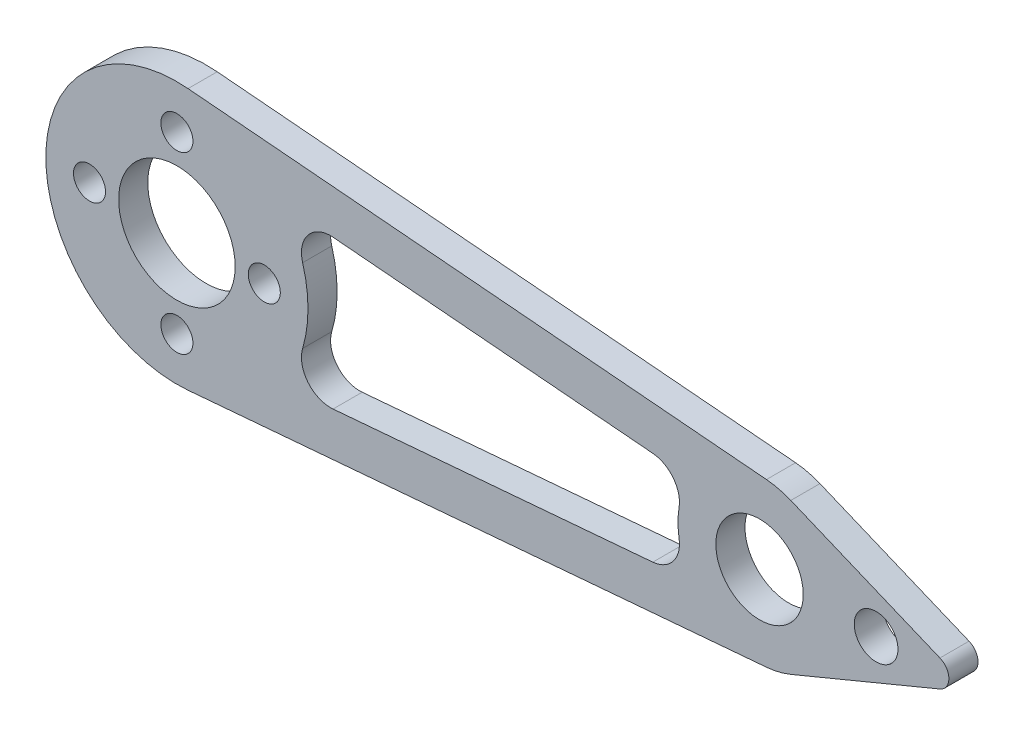
ISO-10303-21;
HEADER;
FILE_DESCRIPTION(('STEP AP214'),'2;1');
FILE_NAME('part.step','',(''),(''),'','','');
FILE_SCHEMA(('AUTOMOTIVE_DESIGN { 1 0 10303 214 1 1 1 1 }'));
ENDSEC;
DATA;
#1=APPLICATION_CONTEXT('core data for automotive mechanical design processes');
#2=APPLICATION_PROTOCOL_DEFINITION('international standard','automotive_design',2000,#1);
#3=PRODUCT_CONTEXT('',#1,'mechanical');
#4=PRODUCT('Part','Part','',(#3));
#5=PRODUCT_RELATED_PRODUCT_CATEGORY('part','',(#4));
#6=PRODUCT_DEFINITION_FORMATION('','',#4);
#7=PRODUCT_DEFINITION_CONTEXT('part definition',#1,'design');
#8=PRODUCT_DEFINITION('design','',#6,#7);
#9=PRODUCT_DEFINITION_SHAPE('','',#8);
#10=(LENGTH_UNIT() NAMED_UNIT(*) SI_UNIT(.MILLI.,.METRE.));
#11=(NAMED_UNIT(*) PLANE_ANGLE_UNIT() SI_UNIT($,.RADIAN.));
#12=(NAMED_UNIT(*) SI_UNIT($,.STERADIAN.) SOLID_ANGLE_UNIT());
#13=UNCERTAINTY_MEASURE_WITH_UNIT(LENGTH_MEASURE(1.E-05),#10,'distance_accuracy_value','');
#14=(GEOMETRIC_REPRESENTATION_CONTEXT(3) GLOBAL_UNCERTAINTY_ASSIGNED_CONTEXT((#13)) GLOBAL_UNIT_ASSIGNED_CONTEXT((#10,
#11,#12)) REPRESENTATION_CONTEXT('',''));
#15=CARTESIAN_POINT('',(0.,0.,0.));
#16=DIRECTION('',(0.,0.,1.));
#17=DIRECTION('',(1.,0.,0.));
#18=AXIS2_PLACEMENT_3D('',#15,#16,#17);
#19=CARTESIAN_POINT('',(40.,0.,0.));
#20=DIRECTION('',(0.,0.,1.));
#21=DIRECTION('',(1.,0.,0.));
#22=AXIS2_PLACEMENT_3D('',#19,#20,#21);
#23=CYLINDRICAL_SURFACE('',#22,5.6);
#24=CARTESIAN_POINT('',(40.,0.,2.));
#25=DIRECTION('',(0.,0.,1.));
#26=DIRECTION('',(1.,0.,0.));
#27=AXIS2_PLACEMENT_3D('',#24,#25,#26);
#28=CIRCLE('',#27,5.6);
#29=CARTESIAN_POINT('',(42.1466666666667,5.1722163742657,2.));
#30=VERTEX_POINT('',#29);
#31=CARTESIAN_POINT('',(40.476,5.57973332696107,2.));
#32=VERTEX_POINT('',#31);
#33=EDGE_CURVE('E188',#30,#32,#28,.T.);
#34=ORIENTED_EDGE('',*,*,#33,.F.);
#35=DIRECTION('',(0.,0.,1.));
#36=VECTOR('',#35,1.);
#37=CARTESIAN_POINT('',(42.1466666666667,5.1722163742657,0.));
#38=LINE('',#37,#36);
#39=CARTESIAN_POINT('',(42.1466666666667,5.1722163742657,0.));
#40=VERTEX_POINT('',#39);
#41=EDGE_CURVE('E306',#40,#30,#38,.T.);
#42=ORIENTED_EDGE('',*,*,#41,.F.);
#43=CARTESIAN_POINT('',(40.,0.,0.));
#44=DIRECTION('',(0.,0.,1.));
#45=DIRECTION('',(1.,0.,0.));
#46=AXIS2_PLACEMENT_3D('',#43,#44,#45);
#47=CIRCLE('',#46,5.6);
#48=CARTESIAN_POINT('',(40.476,5.57973332696107,0.));
#49=VERTEX_POINT('',#48);
#50=EDGE_CURVE('E177',#40,#49,#47,.T.);
#51=ORIENTED_EDGE('',*,*,#50,.T.);
#52=DIRECTION('',(0.,0.,1.));
#53=VECTOR('',#52,1.);
#54=CARTESIAN_POINT('',(40.476,5.57973332696107,0.));
#55=LINE('',#54,#53);
#56=EDGE_CURVE('E198',#49,#32,#55,.T.);
#57=ORIENTED_EDGE('',*,*,#56,.T.);
#58=EDGE_LOOP('',(#34,#42,#51,#57));
#59=FACE_BOUND('',#58,.T.);
#60=ADVANCED_FACE('F33',(#59),#23,.T.);
#61=CARTESIAN_POINT('',(0.,0.,2.));
#62=DIRECTION('',(0.,0.,1.));
#63=DIRECTION('',(1.,0.,0.));
#64=AXIS2_PLACEMENT_3D('',#61,#62,#63);
#65=PLANE('',#64);
#66=CARTESIAN_POINT('',(0.,0.,2.));
#67=DIRECTION('',(0.,0.,-1.));
#68=DIRECTION('',(1.,0.,0.));
#69=AXIS2_PLACEMENT_3D('',#66,#67,#68);
#70=CIRCLE('',#69,9.);
#71=CARTESIAN_POINT('',(8.63170899670432,2.54825426443551,2.));
#72=VERTEX_POINT('',#71);
#73=CARTESIAN_POINT('',(8.63170899670432,-2.54825426443551,2.));
#74=VERTEX_POINT('',#73);
#75=EDGE_CURVE('E276',#72,#74,#70,.T.);
#76=ORIENTED_EDGE('',*,*,#75,.F.);
#77=CARTESIAN_POINT('',(10.5498665515275,3.11453298986563,2.));
#78=DIRECTION('',(0.,0.,1.));
#79=DIRECTION('',(1.,0.,0.));
#80=AXIS2_PLACEMENT_3D('',#77,#78,#79);
#81=CIRCLE('',#80,2.);
#82=CARTESIAN_POINT('',(10.7198665515275,5.10729489235172,2.));
#83=VERTEX_POINT('',#82);
#84=EDGE_CURVE('E41',#72,#83,#81,.F.);
#85=ORIENTED_EDGE('',*,*,#84,.T.);
#86=DIRECTION('',(-0.996380951243047,0.0849999999999999,0.));
#87=VECTOR('',#86,1.);
#88=CARTESIAN_POINT('',(7.19392661539607,5.40808837319584,2.));
#89=LINE('',#88,#87);
#90=CARTESIAN_POINT('',(32.6721401523144,3.23457416867771,2.));
#91=VERTEX_POINT('',#90);
#92=EDGE_CURVE('E275',#91,#83,#89,.T.);
#93=ORIENTED_EDGE('',*,*,#92,.F.);
#94=CARTESIAN_POINT('',(32.5021401523144,1.24181226619161,2.));
#95=DIRECTION('',(0.,0.,1.));
#96=DIRECTION('',(1.,0.,0.));
#97=AXIS2_PLACEMENT_3D('',#94,#95,#96);
#98=CIRCLE('',#97,2.);
#99=CARTESIAN_POINT('',(34.4752611648632,0.915019564562241,2.));
#100=VERTEX_POINT('',#99);
#101=EDGE_CURVE('E262',#91,#100,#98,.F.);
#102=ORIENTED_EDGE('',*,*,#101,.T.);
#103=CARTESIAN_POINT('',(40.,0.,2.));
#104=DIRECTION('',(0.,0.,-1.));
#105=DIRECTION('',(1.,0.,0.));
#106=AXIS2_PLACEMENT_3D('',#103,#104,#105);
#107=CIRCLE('',#106,5.60000000000001);
#108=CARTESIAN_POINT('',(34.4752611648632,-0.915019564562241,2.));
#109=VERTEX_POINT('',#108);
#110=EDGE_CURVE('E286',#109,#100,#107,.T.);
#111=ORIENTED_EDGE('',*,*,#110,.F.);
#112=CARTESIAN_POINT('',(32.5021401523144,-1.24181226619161,2.));
#113=DIRECTION('',(0.,0.,1.));
#114=DIRECTION('',(1.,0.,0.));
#115=AXIS2_PLACEMENT_3D('',#112,#113,#114);
#116=CIRCLE('',#115,2.);
#117=CARTESIAN_POINT('',(32.6721401523144,-3.23457416867771,2.));
#118=VERTEX_POINT('',#117);
#119=EDGE_CURVE('E258',#109,#118,#116,.F.);
#120=ORIENTED_EDGE('',*,*,#119,.T.);
#121=DIRECTION('',(0.996380951243047,0.0849999999999999,0.));
#122=VECTOR('',#121,1.);
#123=CARTESIAN_POINT('',(7.19392661539607,-5.40808837319584,2.));
#124=LINE('',#123,#122);
#125=CARTESIAN_POINT('',(10.7198665515275,-5.10729489235172,2.));
#126=VERTEX_POINT('',#125);
#127=EDGE_CURVE('E305',#126,#118,#124,.T.);
#128=ORIENTED_EDGE('',*,*,#127,.F.);
#129=CARTESIAN_POINT('',(10.5498665515275,-3.11453298986563,2.));
#130=DIRECTION('',(0.,0.,1.));
#131=DIRECTION('',(1.,0.,0.));
#132=AXIS2_PLACEMENT_3D('',#129,#130,#131);
#133=CIRCLE('',#132,2.);
#134=EDGE_CURVE('E266',#126,#74,#133,.F.);
#135=ORIENTED_EDGE('',*,*,#134,.T.);
#136=EDGE_LOOP('',(#76,#85,#93,#102,#111,#120,#128,#135));
#137=FACE_BOUND('',#136,.T.);
#138=CARTESIAN_POINT('',(3.39590937005871E-13,-6.,2.));
#139=DIRECTION('',(0.,0.,1.));
#140=DIRECTION('',(1.,0.,0.));
#141=AXIS2_PLACEMENT_3D('',#138,#139,#140);
#142=CIRCLE('',#141,1.10000000000037);
#143=CARTESIAN_POINT('',(1.1000000000007,-6.,2.));
#144=VERTEX_POINT('',#143);
#145=EDGE_CURVE('E210',#144,#144,#142,.T.);
#146=ORIENTED_EDGE('',*,*,#145,.F.);
#147=EDGE_LOOP('',(#146));
#148=FACE_BOUND('',#147,.T.);
#149=CARTESIAN_POINT('',(0.,0.,2.));
#150=DIRECTION('',(0.,0.,1.));
#151=DIRECTION('',(1.,0.,0.));
#152=AXIS2_PLACEMENT_3D('',#149,#150,#151);
#153=CIRCLE('',#152,4.);
#154=CARTESIAN_POINT('',(4.,0.,2.));
#155=VERTEX_POINT('',#154);
#156=EDGE_CURVE('E222',#155,#155,#153,.T.);
#157=ORIENTED_EDGE('',*,*,#156,.F.);
#158=EDGE_LOOP('',(#157));
#159=FACE_BOUND('',#158,.T.);
#160=CARTESIAN_POINT('',(0.,0.,2.));
#161=DIRECTION('',(0.,0.,1.));
#162=DIRECTION('',(1.,0.,0.));
#163=AXIS2_PLACEMENT_3D('',#160,#161,#162);
#164=CIRCLE('',#163,9.);
#165=CARTESIAN_POINT('',(0.765000000000001,8.96742856118743,2.));
#166=VERTEX_POINT('',#165);
#167=CARTESIAN_POINT('',(0.765000000000001,-8.96742856118743,2.));
#168=VERTEX_POINT('',#167);
#169=EDGE_CURVE('E234',#166,#168,#164,.T.);
#170=ORIENTED_EDGE('',*,*,#169,.T.);
#171=DIRECTION('',(0.996380951243047,0.085,0.));
#172=VECTOR('',#171,1.);
#173=CARTESIAN_POINT('',(0.765000000000001,-8.96742856118743,2.));
#174=LINE('',#173,#172);
#175=CARTESIAN_POINT('',(40.476,-5.57973332696107,2.));
#176=VERTEX_POINT('',#175);
#177=EDGE_CURVE('E185',#168,#176,#174,.T.);
#178=ORIENTED_EDGE('',*,*,#177,.T.);
#179=CARTESIAN_POINT('',(42.1466666666667,-5.1722163742657,2.));
#180=VERTEX_POINT('',#179);
#181=EDGE_CURVE('E190',#176,#180,#28,.T.);
#182=ORIENTED_EDGE('',*,*,#181,.T.);
#183=DIRECTION('',(0.92361006683316,0.383333333333334,0.));
#184=VECTOR('',#183,1.);
#185=CARTESIAN_POINT('',(42.1466666666667,-5.1722163742657,2.));
#186=LINE('',#185,#184);
#187=CARTESIAN_POINT('',(52.3833333333333,-0.923610066833158,2.));
#188=VERTEX_POINT('',#187);
#189=EDGE_CURVE('E153',#180,#188,#186,.T.);
#190=ORIENTED_EDGE('',*,*,#189,.T.);
#191=CARTESIAN_POINT('',(52.,0.,2.));
#192=DIRECTION('',(0.,0.,1.));
#193=DIRECTION('',(1.,0.,0.));
#194=AXIS2_PLACEMENT_3D('',#191,#192,#193);
#195=CIRCLE('',#194,0.999999999999997);
#196=CARTESIAN_POINT('',(52.3833333333333,0.923610066833157,2.));
#197=VERTEX_POINT('',#196);
#198=EDGE_CURVE('E332',#188,#197,#195,.T.);
#199=ORIENTED_EDGE('',*,*,#198,.T.);
#200=DIRECTION('',(-0.92361006683316,0.383333333333334,0.));
#201=VECTOR('',#200,1.);
#202=CARTESIAN_POINT('',(42.1466666666667,5.1722163742657,2.));
#203=LINE('',#202,#201);
#204=EDGE_CURVE('E48',#197,#30,#203,.T.);
#205=ORIENTED_EDGE('',*,*,#204,.T.);
#206=ORIENTED_EDGE('',*,*,#33,.T.);
#207=DIRECTION('',(-0.996380951243047,0.085,0.));
#208=VECTOR('',#207,1.);
#209=CARTESIAN_POINT('',(0.765000000000001,8.96742856118743,2.));
#210=LINE('',#209,#208);
#211=EDGE_CURVE('E192',#32,#166,#210,.T.);
#212=ORIENTED_EDGE('',*,*,#211,.T.);
#213=EDGE_LOOP('',(#170,#178,#182,#190,#199,#205,#206,#212));
#214=FACE_BOUND('',#213,.T.);
#215=CARTESIAN_POINT('',(0.,6.,2.));
#216=DIRECTION('',(0.,0.,1.));
#217=DIRECTION('',(1.,0.,0.));
#218=AXIS2_PLACEMENT_3D('',#215,#216,#217);
#219=CIRCLE('',#218,1.1);
#220=CARTESIAN_POINT('',(1.1,6.,2.));
#221=VERTEX_POINT('',#220);
#222=EDGE_CURVE('E228',#221,#221,#219,.T.);
#223=ORIENTED_EDGE('',*,*,#222,.F.);
#224=EDGE_LOOP('',(#223));
#225=FACE_BOUND('',#224,.T.);
#226=CARTESIAN_POINT('',(6.00000000000017,1.69795468502936E-13,2.));
#227=DIRECTION('',(0.,0.,1.));
#228=DIRECTION('',(1.,0.,0.));
#229=AXIS2_PLACEMENT_3D('',#226,#227,#228);
#230=CIRCLE('',#229,1.10000000000013);
#231=CARTESIAN_POINT('',(7.1000000000003,1.69795468502936E-13,2.));
#232=VERTEX_POINT('',#231);
#233=EDGE_CURVE('E216',#232,#232,#230,.T.);
#234=ORIENTED_EDGE('',*,*,#233,.F.);
#235=EDGE_LOOP('',(#234));
#236=FACE_BOUND('',#235,.T.);
#237=CARTESIAN_POINT('',(-5.99999999999983,-1.70530256582424E-13,2.));
#238=DIRECTION('',(0.,0.,1.));
#239=DIRECTION('',(1.,0.,0.));
#240=AXIS2_PLACEMENT_3D('',#237,#238,#239);
#241=CIRCLE('',#240,1.10000000000027);
#242=CARTESIAN_POINT('',(-4.89999999999956,-1.70530256582424E-13,2.));
#243=VERTEX_POINT('',#242);
#244=EDGE_CURVE('E204',#243,#243,#241,.T.);
#245=ORIENTED_EDGE('',*,*,#244,.F.);
#246=EDGE_LOOP('',(#245));
#247=FACE_BOUND('',#246,.T.);
#248=CARTESIAN_POINT('',(40.,0.,2.));
#249=DIRECTION('',(0.,0.,1.));
#250=DIRECTION('',(1.,0.,0.));
#251=AXIS2_PLACEMENT_3D('',#248,#249,#250);
#252=CIRCLE('',#251,3.);
#253=CARTESIAN_POINT('',(43.,0.,2.));
#254=VERTEX_POINT('',#253);
#255=EDGE_CURVE('E303',#254,#254,#252,.T.);
#256=ORIENTED_EDGE('',*,*,#255,.F.);
#257=EDGE_LOOP('',(#256));
#258=FACE_BOUND('',#257,.T.);
#259=CARTESIAN_POINT('',(48.,0.,2.));
#260=DIRECTION('',(0.,0.,1.));
#261=DIRECTION('',(1.,0.,0.));
#262=AXIS2_PLACEMENT_3D('',#259,#260,#261);
#263=CIRCLE('',#262,1.5);
#264=CARTESIAN_POINT('',(49.5,0.,2.));
#265=VERTEX_POINT('',#264);
#266=EDGE_CURVE('E322',#265,#265,#263,.T.);
#267=ORIENTED_EDGE('',*,*,#266,.F.);
#268=EDGE_LOOP('',(#267));
#269=FACE_BOUND('',#268,.T.);
#270=ADVANCED_FACE('F273',(#137,#148,#159,#214,#225,#236,#247,#258,#269),#65,.T.);
#271=CARTESIAN_POINT('',(0.,0.,0.));
#272=DIRECTION('',(0.,0.,1.));
#273=DIRECTION('',(1.,0.,0.));
#274=AXIS2_PLACEMENT_3D('',#271,#272,#273);
#275=PLANE('',#274);
#276=CARTESIAN_POINT('',(40.,0.,0.));
#277=DIRECTION('',(0.,0.,-1.));
#278=DIRECTION('',(1.,0.,0.));
#279=AXIS2_PLACEMENT_3D('',#276,#277,#278);
#280=CIRCLE('',#279,5.60000000000001);
#281=CARTESIAN_POINT('',(34.4752611648632,-0.915019564562241,0.));
#282=VERTEX_POINT('',#281);
#283=CARTESIAN_POINT('',(34.4752611648632,0.915019564562241,0.));
#284=VERTEX_POINT('',#283);
#285=EDGE_CURVE('E297',#282,#284,#280,.T.);
#286=ORIENTED_EDGE('',*,*,#285,.T.);
#287=CARTESIAN_POINT('',(32.5021401523144,1.24181226619161,0.));
#288=DIRECTION('',(0.,0.,1.));
#289=DIRECTION('',(1.,0.,0.));
#290=AXIS2_PLACEMENT_3D('',#287,#288,#289);
#291=CIRCLE('',#290,2.);
#292=CARTESIAN_POINT('',(32.6721401523144,3.23457416867771,0.));
#293=VERTEX_POINT('',#292);
#294=EDGE_CURVE('E264',#284,#293,#291,.T.);
#295=ORIENTED_EDGE('',*,*,#294,.T.);
#296=DIRECTION('',(-0.996380951243047,0.0849999999999999,0.));
#297=VECTOR('',#296,1.);
#298=CARTESIAN_POINT('',(7.19392661539607,5.40808837319584,0.));
#299=LINE('',#298,#297);
#300=CARTESIAN_POINT('',(10.7198665515275,5.10729489235172,0.));
#301=VERTEX_POINT('',#300);
#302=EDGE_CURVE('E292',#293,#301,#299,.T.);
#303=ORIENTED_EDGE('',*,*,#302,.T.);
#304=CARTESIAN_POINT('',(10.5498665515275,3.11453298986563,0.));
#305=DIRECTION('',(0.,0.,1.));
#306=DIRECTION('',(1.,0.,0.));
#307=AXIS2_PLACEMENT_3D('',#304,#305,#306);
#308=CIRCLE('',#307,2.);
#309=CARTESIAN_POINT('',(8.63170899670432,2.54825426443551,0.));
#310=VERTEX_POINT('',#309);
#311=EDGE_CURVE('E11',#301,#310,#308,.T.);
#312=ORIENTED_EDGE('',*,*,#311,.T.);
#313=CARTESIAN_POINT('',(0.,0.,0.));
#314=DIRECTION('',(0.,0.,-1.));
#315=DIRECTION('',(1.,0.,0.));
#316=AXIS2_PLACEMENT_3D('',#313,#314,#315);
#317=CIRCLE('',#316,9.);
#318=CARTESIAN_POINT('',(8.63170899670432,-2.54825426443551,0.));
#319=VERTEX_POINT('',#318);
#320=EDGE_CURVE('E285',#310,#319,#317,.T.);
#321=ORIENTED_EDGE('',*,*,#320,.T.);
#322=CARTESIAN_POINT('',(10.5498665515275,-3.11453298986563,0.));
#323=DIRECTION('',(0.,0.,1.));
#324=DIRECTION('',(1.,0.,0.));
#325=AXIS2_PLACEMENT_3D('',#322,#323,#324);
#326=CIRCLE('',#325,2.);
#327=CARTESIAN_POINT('',(10.7198665515275,-5.10729489235172,0.));
#328=VERTEX_POINT('',#327);
#329=EDGE_CURVE('E268',#319,#328,#326,.T.);
#330=ORIENTED_EDGE('',*,*,#329,.T.);
#331=DIRECTION('',(0.996380951243047,0.0849999999999999,0.));
#332=VECTOR('',#331,1.);
#333=CARTESIAN_POINT('',(7.19392661539607,-5.40808837319584,0.));
#334=LINE('',#333,#332);
#335=CARTESIAN_POINT('',(32.6721401523144,-3.23457416867771,0.));
#336=VERTEX_POINT('',#335);
#337=EDGE_CURVE('E294',#328,#336,#334,.T.);
#338=ORIENTED_EDGE('',*,*,#337,.T.);
#339=CARTESIAN_POINT('',(32.5021401523144,-1.24181226619161,0.));
#340=DIRECTION('',(0.,0.,1.));
#341=DIRECTION('',(1.,0.,0.));
#342=AXIS2_PLACEMENT_3D('',#339,#340,#341);
#343=CIRCLE('',#342,2.);
#344=EDGE_CURVE('E260',#336,#282,#343,.T.);
#345=ORIENTED_EDGE('',*,*,#344,.T.);
#346=EDGE_LOOP('',(#286,#295,#303,#312,#321,#330,#338,#345));
#347=FACE_BOUND('',#346,.T.);
#348=CARTESIAN_POINT('',(0.,0.,0.));
#349=DIRECTION('',(0.,0.,1.));
#350=DIRECTION('',(1.,0.,0.));
#351=AXIS2_PLACEMENT_3D('',#348,#349,#350);
#352=CIRCLE('',#351,9.);
#353=CARTESIAN_POINT('',(0.765000000000001,8.96742856118743,0.));
#354=VERTEX_POINT('',#353);
#355=CARTESIAN_POINT('',(0.765000000000001,-8.96742856118743,0.));
#356=VERTEX_POINT('',#355);
#357=EDGE_CURVE('E231',#354,#356,#352,.T.);
#358=ORIENTED_EDGE('',*,*,#357,.F.);
#359=DIRECTION('',(-0.996380951243047,0.085,0.));
#360=VECTOR('',#359,1.);
#361=CARTESIAN_POINT('',(0.765000000000001,8.96742856118743,0.));
#362=LINE('',#361,#360);
#363=EDGE_CURVE('E176',#49,#354,#362,.T.);
#364=ORIENTED_EDGE('',*,*,#363,.F.);
#365=ORIENTED_EDGE('',*,*,#50,.F.);
#366=DIRECTION('',(-0.92361006683316,0.383333333333334,0.));
#367=VECTOR('',#366,1.);
#368=CARTESIAN_POINT('',(42.1466666666667,5.1722163742657,0.));
#369=LINE('',#368,#367);
#370=CARTESIAN_POINT('',(52.3833333333333,0.923610066833157,0.));
#371=VERTEX_POINT('',#370);
#372=EDGE_CURVE('E159',#371,#40,#369,.T.);
#373=ORIENTED_EDGE('',*,*,#372,.F.);
#374=CARTESIAN_POINT('',(52.,0.,0.));
#375=DIRECTION('',(0.,0.,1.));
#376=DIRECTION('',(1.,0.,0.));
#377=AXIS2_PLACEMENT_3D('',#374,#375,#376);
#378=CIRCLE('',#377,0.999999999999997);
#379=CARTESIAN_POINT('',(52.3833333333333,-0.923610066833158,0.));
#380=VERTEX_POINT('',#379);
#381=EDGE_CURVE('E172',#380,#371,#378,.T.);
#382=ORIENTED_EDGE('',*,*,#381,.F.);
#383=DIRECTION('',(0.92361006683316,0.383333333333334,0.));
#384=VECTOR('',#383,1.);
#385=CARTESIAN_POINT('',(42.1466666666667,-5.1722163742657,0.));
#386=LINE('',#385,#384);
#387=CARTESIAN_POINT('',(42.1466666666667,-5.1722163742657,0.));
#388=VERTEX_POINT('',#387);
#389=EDGE_CURVE('E151',#388,#380,#386,.T.);
#390=ORIENTED_EDGE('',*,*,#389,.F.);
#391=CARTESIAN_POINT('',(40.476,-5.57973332696107,0.));
#392=VERTEX_POINT('',#391);
#393=EDGE_CURVE('E168',#392,#388,#47,.T.);
#394=ORIENTED_EDGE('',*,*,#393,.F.);
#395=DIRECTION('',(0.996380951243047,0.085,0.));
#396=VECTOR('',#395,1.);
#397=CARTESIAN_POINT('',(0.765000000000001,-8.96742856118743,0.));
#398=LINE('',#397,#396);
#399=EDGE_CURVE('E181',#356,#392,#398,.T.);
#400=ORIENTED_EDGE('',*,*,#399,.F.);
#401=EDGE_LOOP('',(#358,#364,#365,#373,#382,#390,#394,#400));
#402=FACE_BOUND('',#401,.T.);
#403=CARTESIAN_POINT('',(0.,6.,0.));
#404=DIRECTION('',(0.,0.,1.));
#405=DIRECTION('',(1.,0.,0.));
#406=AXIS2_PLACEMENT_3D('',#403,#404,#405);
#407=CIRCLE('',#406,1.1);
#408=CARTESIAN_POINT('',(1.1,6.,0.));
#409=VERTEX_POINT('',#408);
#410=EDGE_CURVE('E225',#409,#409,#407,.T.);
#411=ORIENTED_EDGE('',*,*,#410,.T.);
#412=EDGE_LOOP('',(#411));
#413=FACE_BOUND('',#412,.T.);
#414=CARTESIAN_POINT('',(0.,0.,0.));
#415=DIRECTION('',(0.,0.,1.));
#416=DIRECTION('',(1.,0.,0.));
#417=AXIS2_PLACEMENT_3D('',#414,#415,#416);
#418=CIRCLE('',#417,4.);
#419=CARTESIAN_POINT('',(4.,0.,0.));
#420=VERTEX_POINT('',#419);
#421=EDGE_CURVE('E219',#420,#420,#418,.T.);
#422=ORIENTED_EDGE('',*,*,#421,.T.);
#423=EDGE_LOOP('',(#422));
#424=FACE_BOUND('',#423,.T.);
#425=CARTESIAN_POINT('',(6.00000000000017,1.69795468502936E-13,0.));
#426=DIRECTION('',(0.,0.,1.));
#427=DIRECTION('',(1.,0.,0.));
#428=AXIS2_PLACEMENT_3D('',#425,#426,#427);
#429=CIRCLE('',#428,1.10000000000013);
#430=CARTESIAN_POINT('',(7.1000000000003,1.69795468502936E-13,0.));
#431=VERTEX_POINT('',#430);
#432=EDGE_CURVE('E213',#431,#431,#429,.T.);
#433=ORIENTED_EDGE('',*,*,#432,.T.);
#434=EDGE_LOOP('',(#433));
#435=FACE_BOUND('',#434,.T.);
#436=CARTESIAN_POINT('',(3.39590937005871E-13,-6.,0.));
#437=DIRECTION('',(0.,0.,1.));
#438=DIRECTION('',(1.,0.,0.));
#439=AXIS2_PLACEMENT_3D('',#436,#437,#438);
#440=CIRCLE('',#439,1.10000000000037);
#441=CARTESIAN_POINT('',(1.1000000000007,-6.,0.));
#442=VERTEX_POINT('',#441);
#443=EDGE_CURVE('E207',#442,#442,#440,.T.);
#444=ORIENTED_EDGE('',*,*,#443,.T.);
#445=EDGE_LOOP('',(#444));
#446=FACE_BOUND('',#445,.T.);
#447=CARTESIAN_POINT('',(-5.99999999999983,-1.70530256582424E-13,0.));
#448=DIRECTION('',(0.,0.,1.));
#449=DIRECTION('',(1.,0.,0.));
#450=AXIS2_PLACEMENT_3D('',#447,#448,#449);
#451=CIRCLE('',#450,1.10000000000027);
#452=CARTESIAN_POINT('',(-4.89999999999956,-1.70530256582424E-13,0.));
#453=VERTEX_POINT('',#452);
#454=EDGE_CURVE('E197',#453,#453,#451,.T.);
#455=ORIENTED_EDGE('',*,*,#454,.T.);
#456=EDGE_LOOP('',(#455));
#457=FACE_BOUND('',#456,.T.);
#458=CARTESIAN_POINT('',(40.,0.,0.));
#459=DIRECTION('',(0.,0.,1.));
#460=DIRECTION('',(1.,0.,0.));
#461=AXIS2_PLACEMENT_3D('',#458,#459,#460);
#462=CIRCLE('',#461,3.);
#463=CARTESIAN_POINT('',(43.,0.,0.));
#464=VERTEX_POINT('',#463);
#465=EDGE_CURVE('E189',#464,#464,#462,.T.);
#466=ORIENTED_EDGE('',*,*,#465,.T.);
#467=EDGE_LOOP('',(#466));
#468=FACE_BOUND('',#467,.T.);
#469=CARTESIAN_POINT('',(48.,0.,0.));
#470=DIRECTION('',(0.,0.,1.));
#471=DIRECTION('',(1.,0.,0.));
#472=AXIS2_PLACEMENT_3D('',#469,#470,#471);
#473=CIRCLE('',#472,1.5);
#474=CARTESIAN_POINT('',(49.5,0.,0.));
#475=VERTEX_POINT('',#474);
#476=EDGE_CURVE('E324',#475,#475,#473,.T.);
#477=ORIENTED_EDGE('',*,*,#476,.T.);
#478=EDGE_LOOP('',(#477));
#479=FACE_BOUND('',#478,.T.);
#480=ADVANCED_FACE('F165',(#347,#402,#413,#424,#435,#446,#457,#468,#479),#275,.F.);
#481=CARTESIAN_POINT('',(0.,0.,2.));
#482=DIRECTION('',(0.,0.,-1.));
#483=DIRECTION('',(-1.,0.,0.));
#484=AXIS2_PLACEMENT_3D('',#481,#482,#483);
#485=CYLINDRICAL_SURFACE('',#484,9.);
#486=ORIENTED_EDGE('',*,*,#169,.F.);
#487=DIRECTION('',(0.,0.,1.));
#488=VECTOR('',#487,1.);
#489=CARTESIAN_POINT('',(0.765000000000001,8.96742856118743,0.));
#490=LINE('',#489,#488);
#491=EDGE_CURVE('E194',#354,#166,#490,.T.);
#492=ORIENTED_EDGE('',*,*,#491,.F.);
#493=ORIENTED_EDGE('',*,*,#357,.T.);
#494=DIRECTION('',(0.,0.,1.));
#495=VECTOR('',#494,1.);
#496=CARTESIAN_POINT('',(0.765000000000001,-8.96742856118743,0.));
#497=LINE('',#496,#495);
#498=EDGE_CURVE('E179',#356,#168,#497,.T.);
#499=ORIENTED_EDGE('',*,*,#498,.T.);
#500=EDGE_LOOP('',(#486,#492,#493,#499));
#501=FACE_BOUND('',#500,.T.);
#502=ADVANCED_FACE('F345',(#501),#485,.T.);
#503=CARTESIAN_POINT('',(0.,6.,2.));
#504=DIRECTION('',(0.,0.,-1.));
#505=DIRECTION('',(-1.,0.,0.));
#506=AXIS2_PLACEMENT_3D('',#503,#504,#505);
#507=CYLINDRICAL_SURFACE('',#506,1.1);
#508=ORIENTED_EDGE('',*,*,#222,.T.);
#509=EDGE_LOOP('',(#508));
#510=FACE_BOUND('',#509,.T.);
#511=ORIENTED_EDGE('',*,*,#410,.F.);
#512=EDGE_LOOP('',(#511));
#513=FACE_BOUND('',#512,.T.);
#514=ADVANCED_FACE('F417',(#510,#513),#507,.F.);
#515=CARTESIAN_POINT('',(0.,0.,2.));
#516=DIRECTION('',(0.,0.,-1.));
#517=DIRECTION('',(-1.,0.,0.));
#518=AXIS2_PLACEMENT_3D('',#515,#516,#517);
#519=CYLINDRICAL_SURFACE('',#518,4.);
#520=ORIENTED_EDGE('',*,*,#156,.T.);
#521=EDGE_LOOP('',(#520));
#522=FACE_BOUND('',#521,.T.);
#523=ORIENTED_EDGE('',*,*,#421,.F.);
#524=EDGE_LOOP('',(#523));
#525=FACE_BOUND('',#524,.T.);
#526=ADVANCED_FACE('F571',(#522,#525),#519,.F.);
#527=CARTESIAN_POINT('',(6.00000000000017,1.69795468502936E-13,2.));
#528=DIRECTION('',(0.,0.,-1.));
#529=DIRECTION('',(-1.,0.,0.));
#530=AXIS2_PLACEMENT_3D('',#527,#528,#529);
#531=CYLINDRICAL_SURFACE('',#530,1.10000000000013);
#532=ORIENTED_EDGE('',*,*,#233,.T.);
#533=EDGE_LOOP('',(#532));
#534=FACE_BOUND('',#533,.T.);
#535=ORIENTED_EDGE('',*,*,#432,.F.);
#536=EDGE_LOOP('',(#535));
#537=FACE_BOUND('',#536,.T.);
#538=ADVANCED_FACE('F561',(#534,#537),#531,.F.);
#539=CARTESIAN_POINT('',(3.39590937005871E-13,-6.,2.));
#540=DIRECTION('',(0.,0.,-1.));
#541=DIRECTION('',(-1.,0.,0.));
#542=AXIS2_PLACEMENT_3D('',#539,#540,#541);
#543=CYLINDRICAL_SURFACE('',#542,1.10000000000037);
#544=ORIENTED_EDGE('',*,*,#145,.T.);
#545=EDGE_LOOP('',(#544));
#546=FACE_BOUND('',#545,.T.);
#547=ORIENTED_EDGE('',*,*,#443,.F.);
#548=EDGE_LOOP('',(#547));
#549=FACE_BOUND('',#548,.T.);
#550=ADVANCED_FACE('F382',(#546,#549),#543,.F.);
#551=CARTESIAN_POINT('',(-5.99999999999983,-1.70530256582424E-13,2.));
#552=DIRECTION('',(0.,0.,-1.));
#553=DIRECTION('',(-1.,0.,0.));
#554=AXIS2_PLACEMENT_3D('',#551,#552,#553);
#555=CYLINDRICAL_SURFACE('',#554,1.10000000000027);
#556=ORIENTED_EDGE('',*,*,#244,.T.);
#557=EDGE_LOOP('',(#556));
#558=FACE_BOUND('',#557,.T.);
#559=ORIENTED_EDGE('',*,*,#454,.F.);
#560=EDGE_LOOP('',(#559));
#561=FACE_BOUND('',#560,.T.);
#562=ADVANCED_FACE('F378',(#558,#561),#555,.F.);
#563=CARTESIAN_POINT('',(0.765000000000001,8.96742856118743,0.));
#564=DIRECTION('',(0.085,0.996380951243047,0.));
#565=DIRECTION('',(-0.996380951243047,0.085,0.));
#566=AXIS2_PLACEMENT_3D('',#563,#564,#565);
#567=PLANE('',#566);
#568=ORIENTED_EDGE('',*,*,#211,.F.);
#569=ORIENTED_EDGE('',*,*,#56,.F.);
#570=ORIENTED_EDGE('',*,*,#363,.T.);
#571=ORIENTED_EDGE('',*,*,#491,.T.);
#572=EDGE_LOOP('',(#568,#569,#570,#571));
#573=FACE_BOUND('',#572,.T.);
#574=ADVANCED_FACE('F352',(#573),#567,.T.);
#575=DIRECTION('',(0.,0.,1.));
#576=VECTOR('',#575,1.);
#577=CARTESIAN_POINT('',(42.1466666666667,-5.1722163742657,0.));
#578=LINE('',#577,#576);
#579=EDGE_CURVE('E148',#388,#180,#578,.T.);
#580=ORIENTED_EDGE('',*,*,#579,.T.);
#581=ORIENTED_EDGE('',*,*,#181,.F.);
#582=DIRECTION('',(0.,0.,1.));
#583=VECTOR('',#582,1.);
#584=CARTESIAN_POINT('',(40.476,-5.57973332696107,0.));
#585=LINE('',#584,#583);
#586=EDGE_CURVE('E175',#392,#176,#585,.T.);
#587=ORIENTED_EDGE('',*,*,#586,.F.);
#588=ORIENTED_EDGE('',*,*,#393,.T.);
#589=EDGE_LOOP('',(#580,#581,#587,#588));
#590=FACE_BOUND('',#589,.T.);
#591=ADVANCED_FACE('F174',(#590),#23,.T.);
#592=CARTESIAN_POINT('',(0.765000000000001,-8.96742856118743,0.));
#593=DIRECTION('',(0.085,-0.996380951243047,0.));
#594=DIRECTION('',(0.996380951243047,0.085,0.));
#595=AXIS2_PLACEMENT_3D('',#592,#593,#594);
#596=PLANE('',#595);
#597=ORIENTED_EDGE('',*,*,#177,.F.);
#598=ORIENTED_EDGE('',*,*,#498,.F.);
#599=ORIENTED_EDGE('',*,*,#399,.T.);
#600=ORIENTED_EDGE('',*,*,#586,.T.);
#601=EDGE_LOOP('',(#597,#598,#599,#600));
#602=FACE_BOUND('',#601,.T.);
#603=ADVANCED_FACE('F343',(#602),#596,.T.);
#604=CARTESIAN_POINT('',(40.,0.,0.));
#605=DIRECTION('',(0.,0.,1.));
#606=DIRECTION('',(1.,0.,0.));
#607=AXIS2_PLACEMENT_3D('',#604,#605,#606);
#608=CYLINDRICAL_SURFACE('',#607,3.);
#609=ORIENTED_EDGE('',*,*,#465,.F.);
#610=EDGE_LOOP('',(#609));
#611=FACE_BOUND('',#610,.T.);
#612=ORIENTED_EDGE('',*,*,#255,.T.);
#613=EDGE_LOOP('',(#612));
#614=FACE_BOUND('',#613,.T.);
#615=ADVANCED_FACE('F315',(#611,#614),#608,.F.);
#616=CARTESIAN_POINT('',(0.,0.,0.));
#617=DIRECTION('',(0.,0.,1.));
#618=DIRECTION('',(1.,0.,0.));
#619=AXIS2_PLACEMENT_3D('',#616,#617,#618);
#620=CYLINDRICAL_SURFACE('',#619,9.);
#621=ORIENTED_EDGE('',*,*,#75,.T.);
#622=DIRECTION('',(0.,0.,1.));
#623=VECTOR('',#622,1.);
#624=CARTESIAN_POINT('',(8.63170899670432,-2.54825426443551,0.));
#625=LINE('',#624,#623);
#626=EDGE_CURVE('E56',#74,#319,#625,.F.);
#627=ORIENTED_EDGE('',*,*,#626,.T.);
#628=ORIENTED_EDGE('',*,*,#320,.F.);
#629=DIRECTION('',(0.,0.,1.));
#630=VECTOR('',#629,1.);
#631=CARTESIAN_POINT('',(8.63170899670432,2.54825426443551,0.));
#632=LINE('',#631,#630);
#633=EDGE_CURVE('E254',#310,#72,#632,.T.);
#634=ORIENTED_EDGE('',*,*,#633,.T.);
#635=EDGE_LOOP('',(#621,#627,#628,#634));
#636=FACE_BOUND('',#635,.T.);
#637=ADVANCED_FACE('F293',(#636),#620,.T.);
#638=CARTESIAN_POINT('',(7.19392661539607,5.40808837319584,0.));
#639=DIRECTION('',(0.0849999999999999,0.996380951243047,0.));
#640=DIRECTION('',(-0.996380951243047,0.0849999999999999,0.));
#641=AXIS2_PLACEMENT_3D('',#638,#639,#640);
#642=PLANE('',#641);
#643=ORIENTED_EDGE('',*,*,#302,.F.);
#644=DIRECTION('',(0.,0.,-1.));
#645=VECTOR('',#644,1.);
#646=CARTESIAN_POINT('',(32.6721401523144,3.23457416867771,2.));
#647=LINE('',#646,#645);
#648=EDGE_CURVE('E251',#293,#91,#647,.F.);
#649=ORIENTED_EDGE('',*,*,#648,.T.);
#650=ORIENTED_EDGE('',*,*,#92,.T.);
#651=DIRECTION('',(0.,0.,-1.));
#652=VECTOR('',#651,1.);
#653=CARTESIAN_POINT('',(10.7198665515275,5.10729489235172,0.));
#654=LINE('',#653,#652);
#655=EDGE_CURVE('E249',#83,#301,#654,.T.);
#656=ORIENTED_EDGE('',*,*,#655,.T.);
#657=EDGE_LOOP('',(#643,#649,#650,#656));
#658=FACE_BOUND('',#657,.T.);
#659=ADVANCED_FACE('F282',(#658),#642,.F.);
#660=CARTESIAN_POINT('',(40.,0.,0.));
#661=DIRECTION('',(0.,0.,1.));
#662=DIRECTION('',(1.,0.,0.));
#663=AXIS2_PLACEMENT_3D('',#660,#661,#662);
#664=CYLINDRICAL_SURFACE('',#663,5.60000000000001);
#665=ORIENTED_EDGE('',*,*,#285,.F.);
#666=DIRECTION('',(0.,0.,1.));
#667=VECTOR('',#666,1.);
#668=CARTESIAN_POINT('',(34.4752611648632,-0.915019564562241,0.));
#669=LINE('',#668,#667);
#670=EDGE_CURVE('E241',#282,#109,#669,.T.);
#671=ORIENTED_EDGE('',*,*,#670,.T.);
#672=ORIENTED_EDGE('',*,*,#110,.T.);
#673=DIRECTION('',(0.,0.,1.));
#674=VECTOR('',#673,1.);
#675=CARTESIAN_POINT('',(34.4752611648632,0.915019564562241,0.));
#676=LINE('',#675,#674);
#677=EDGE_CURVE('E237',#100,#284,#676,.F.);
#678=ORIENTED_EDGE('',*,*,#677,.T.);
#679=EDGE_LOOP('',(#665,#671,#672,#678));
#680=FACE_BOUND('',#679,.T.);
#681=ADVANCED_FACE('F395',(#680),#664,.T.);
#682=CARTESIAN_POINT('',(7.19392661539607,-5.40808837319584,0.));
#683=DIRECTION('',(0.0849999999999999,-0.996380951243047,0.));
#684=DIRECTION('',(0.996380951243047,0.0849999999999999,0.));
#685=AXIS2_PLACEMENT_3D('',#682,#683,#684);
#686=PLANE('',#685);
#687=ORIENTED_EDGE('',*,*,#127,.T.);
#688=DIRECTION('',(0.,0.,-1.));
#689=VECTOR('',#688,1.);
#690=CARTESIAN_POINT('',(32.6721401523144,-3.23457416867771,0.));
#691=LINE('',#690,#689);
#692=EDGE_CURVE('E247',#118,#336,#691,.T.);
#693=ORIENTED_EDGE('',*,*,#692,.T.);
#694=ORIENTED_EDGE('',*,*,#337,.F.);
#695=DIRECTION('',(0.,0.,-1.));
#696=VECTOR('',#695,1.);
#697=CARTESIAN_POINT('',(10.7198665515275,-5.10729489235172,2.));
#698=LINE('',#697,#696);
#699=EDGE_CURVE('E244',#328,#126,#698,.F.);
#700=ORIENTED_EDGE('',*,*,#699,.T.);
#701=EDGE_LOOP('',(#687,#693,#694,#700));
#702=FACE_BOUND('',#701,.T.);
#703=ADVANCED_FACE('F391',(#702),#686,.F.);
#704=CARTESIAN_POINT('',(32.5021401523144,-1.24181226619161,0.));
#705=DIRECTION('',(0.,0.,1.));
#706=DIRECTION('',(1.,0.,0.));
#707=AXIS2_PLACEMENT_3D('',#704,#705,#706);
#708=CYLINDRICAL_SURFACE('',#707,2.);
#709=ORIENTED_EDGE('',*,*,#344,.F.);
#710=ORIENTED_EDGE('',*,*,#692,.F.);
#711=ORIENTED_EDGE('',*,*,#119,.F.);
#712=ORIENTED_EDGE('',*,*,#670,.F.);
#713=EDGE_LOOP('',(#709,#710,#711,#712));
#714=FACE_BOUND('',#713,.T.);
#715=ADVANCED_FACE('F394',(#714),#708,.F.);
#716=CARTESIAN_POINT('',(32.5021401523144,1.24181226619161,0.));
#717=DIRECTION('',(0.,0.,1.));
#718=DIRECTION('',(1.,0.,0.));
#719=AXIS2_PLACEMENT_3D('',#716,#717,#718);
#720=CYLINDRICAL_SURFACE('',#719,2.);
#721=ORIENTED_EDGE('',*,*,#294,.F.);
#722=ORIENTED_EDGE('',*,*,#677,.F.);
#723=ORIENTED_EDGE('',*,*,#101,.F.);
#724=ORIENTED_EDGE('',*,*,#648,.F.);
#725=EDGE_LOOP('',(#721,#722,#723,#724));
#726=FACE_BOUND('',#725,.T.);
#727=ADVANCED_FACE('F423',(#726),#720,.F.);
#728=CARTESIAN_POINT('',(10.5498665515275,-3.11453298986563,0.));
#729=DIRECTION('',(0.,0.,1.));
#730=DIRECTION('',(1.,0.,0.));
#731=AXIS2_PLACEMENT_3D('',#728,#729,#730);
#732=CYLINDRICAL_SURFACE('',#731,2.);
#733=ORIENTED_EDGE('',*,*,#329,.F.);
#734=ORIENTED_EDGE('',*,*,#626,.F.);
#735=ORIENTED_EDGE('',*,*,#134,.F.);
#736=ORIENTED_EDGE('',*,*,#699,.F.);
#737=EDGE_LOOP('',(#733,#734,#735,#736));
#738=FACE_BOUND('',#737,.T.);
#739=ADVANCED_FACE('F365',(#738),#732,.F.);
#740=CARTESIAN_POINT('',(10.5498665515275,3.11453298986563,0.));
#741=DIRECTION('',(0.,0.,1.));
#742=DIRECTION('',(1.,0.,0.));
#743=AXIS2_PLACEMENT_3D('',#740,#741,#742);
#744=CYLINDRICAL_SURFACE('',#743,2.);
#745=ORIENTED_EDGE('',*,*,#311,.F.);
#746=ORIENTED_EDGE('',*,*,#655,.F.);
#747=ORIENTED_EDGE('',*,*,#84,.F.);
#748=ORIENTED_EDGE('',*,*,#633,.F.);
#749=EDGE_LOOP('',(#745,#746,#747,#748));
#750=FACE_BOUND('',#749,.T.);
#751=ADVANCED_FACE('F35',(#750),#744,.F.);
#752=CARTESIAN_POINT('',(42.1466666666667,5.1722163742657,0.));
#753=DIRECTION('',(0.383333333333334,0.92361006683316,0.));
#754=DIRECTION('',(-0.92361006683316,0.383333333333334,0.));
#755=AXIS2_PLACEMENT_3D('',#752,#753,#754);
#756=PLANE('',#755);
#757=ORIENTED_EDGE('',*,*,#204,.F.);
#758=DIRECTION('',(0.,0.,1.));
#759=VECTOR('',#758,1.);
#760=CARTESIAN_POINT('',(52.3833333333333,0.923610066833157,0.));
#761=LINE('',#760,#759);
#762=EDGE_CURVE('E336',#371,#197,#761,.T.);
#763=ORIENTED_EDGE('',*,*,#762,.F.);
#764=ORIENTED_EDGE('',*,*,#372,.T.);
#765=ORIENTED_EDGE('',*,*,#41,.T.);
#766=EDGE_LOOP('',(#757,#763,#764,#765));
#767=FACE_BOUND('',#766,.T.);
#768=ADVANCED_FACE('F357',(#767),#756,.T.);
#769=CARTESIAN_POINT('',(52.,0.,0.));
#770=DIRECTION('',(0.,0.,1.));
#771=DIRECTION('',(1.,0.,0.));
#772=AXIS2_PLACEMENT_3D('',#769,#770,#771);
#773=CYLINDRICAL_SURFACE('',#772,0.999999999999997);
#774=ORIENTED_EDGE('',*,*,#198,.F.);
#775=DIRECTION('',(0.,0.,1.));
#776=VECTOR('',#775,1.);
#777=CARTESIAN_POINT('',(52.3833333333333,-0.923610066833158,0.));
#778=LINE('',#777,#776);
#779=EDGE_CURVE('E158',#380,#188,#778,.T.);
#780=ORIENTED_EDGE('',*,*,#779,.F.);
#781=ORIENTED_EDGE('',*,*,#381,.T.);
#782=ORIENTED_EDGE('',*,*,#762,.T.);
#783=EDGE_LOOP('',(#774,#780,#781,#782));
#784=FACE_BOUND('',#783,.T.);
#785=ADVANCED_FACE('F339',(#784),#773,.T.);
#786=CARTESIAN_POINT('',(42.1466666666667,-5.1722163742657,0.));
#787=DIRECTION('',(0.383333333333334,-0.92361006683316,0.));
#788=DIRECTION('',(0.92361006683316,0.383333333333334,0.));
#789=AXIS2_PLACEMENT_3D('',#786,#787,#788);
#790=PLANE('',#789);
#791=ORIENTED_EDGE('',*,*,#189,.F.);
#792=ORIENTED_EDGE('',*,*,#579,.F.);
#793=ORIENTED_EDGE('',*,*,#389,.T.);
#794=ORIENTED_EDGE('',*,*,#779,.T.);
#795=EDGE_LOOP('',(#791,#792,#793,#794));
#796=FACE_BOUND('',#795,.T.);
#797=ADVANCED_FACE('F150',(#796),#790,.T.);
#798=CARTESIAN_POINT('',(48.,0.,0.));
#799=DIRECTION('',(0.,0.,1.));
#800=DIRECTION('',(1.,0.,0.));
#801=AXIS2_PLACEMENT_3D('',#798,#799,#800);
#802=CYLINDRICAL_SURFACE('',#801,1.5);
#803=ORIENTED_EDGE('',*,*,#476,.F.);
#804=EDGE_LOOP('',(#803));
#805=FACE_BOUND('',#804,.T.);
#806=ORIENTED_EDGE('',*,*,#266,.T.);
#807=EDGE_LOOP('',(#806));
#808=FACE_BOUND('',#807,.T.);
#809=ADVANCED_FACE('F403',(#805,#808),#802,.F.);
#810=CLOSED_SHELL('',(#60,#270,#480,#502,#514,#526,#538,#550,#562,#574,#591,#603,#615,#637,#659,
#681,#703,#715,#727,#739,#751,#768,#785,#797,#809));
#811=MANIFOLD_SOLID_BREP('B2',#810);
#812=ADVANCED_BREP_SHAPE_REPRESENTATION('',(#18,#811),#14);
#813=SHAPE_DEFINITION_REPRESENTATION(#9,#812);
ENDSEC;
END-ISO-10303-21;
